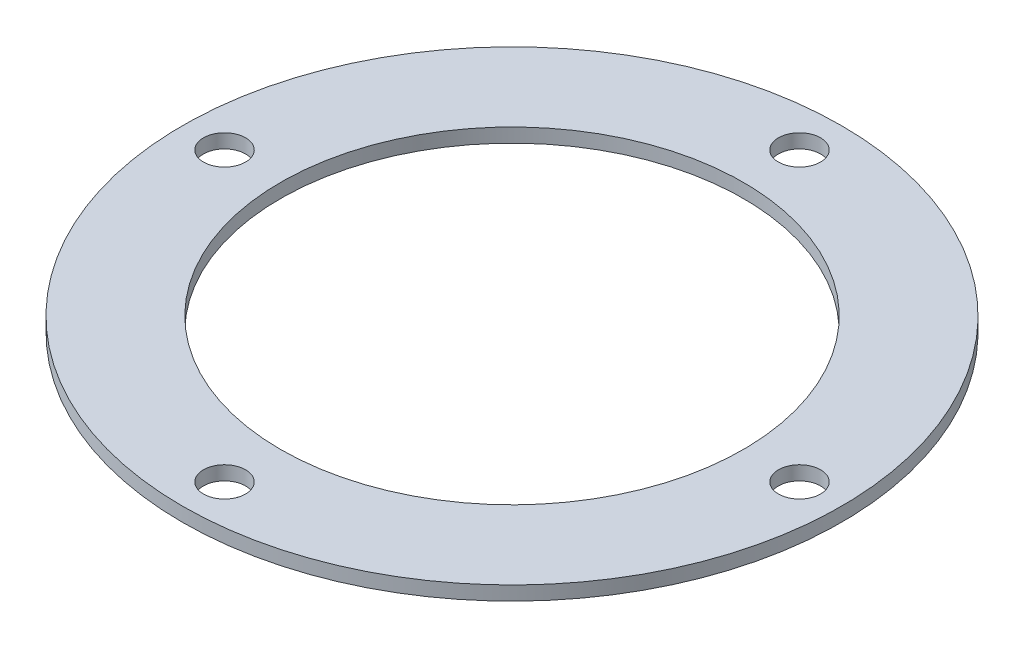
ISO-10303-21;
HEADER;
FILE_DESCRIPTION(('STEP AP214'),'2;1');
FILE_NAME('part.step','',(''),(''),'','','');
FILE_SCHEMA(('AUTOMOTIVE_DESIGN { 1 0 10303 214 1 1 1 1 }'));
ENDSEC;
DATA;
#1=APPLICATION_CONTEXT('core data for automotive mechanical design processes');
#2=APPLICATION_PROTOCOL_DEFINITION('international standard','automotive_design',2000,#1);
#3=PRODUCT_CONTEXT('',#1,'mechanical');
#4=PRODUCT('Part','Part','',(#3));
#5=PRODUCT_RELATED_PRODUCT_CATEGORY('part','',(#4));
#6=PRODUCT_DEFINITION_FORMATION('','',#4);
#7=PRODUCT_DEFINITION_CONTEXT('part definition',#1,'design');
#8=PRODUCT_DEFINITION('design','',#6,#7);
#9=PRODUCT_DEFINITION_SHAPE('','',#8);
#10=(LENGTH_UNIT() NAMED_UNIT(*) SI_UNIT(.MILLI.,.METRE.));
#11=(NAMED_UNIT(*) PLANE_ANGLE_UNIT() SI_UNIT($,.RADIAN.));
#12=(NAMED_UNIT(*) SI_UNIT($,.STERADIAN.) SOLID_ANGLE_UNIT());
#13=UNCERTAINTY_MEASURE_WITH_UNIT(LENGTH_MEASURE(1.E-05),#10,'distance_accuracy_value','');
#14=(GEOMETRIC_REPRESENTATION_CONTEXT(3) GLOBAL_UNCERTAINTY_ASSIGNED_CONTEXT((#13)) GLOBAL_UNIT_ASSIGNED_CONTEXT((#10,
#11,#12)) REPRESENTATION_CONTEXT('',''));
#15=CARTESIAN_POINT('',(0.,0.,0.));
#16=DIRECTION('',(0.,0.,1.));
#17=DIRECTION('',(1.,0.,0.));
#18=AXIS2_PLACEMENT_3D('',#15,#16,#17);
#19=CARTESIAN_POINT('',(0.,1.,0.));
#20=DIRECTION('',(0.,1.,0.));
#21=DIRECTION('',(0.,0.,1.));
#22=AXIS2_PLACEMENT_3D('',#19,#20,#21);
#23=PLANE('',#22);
#24=CARTESIAN_POINT('',(20.5,1.,0.));
#25=DIRECTION('',(0.,1.,0.));
#26=DIRECTION('',(0.,0.,1.));
#27=AXIS2_PLACEMENT_3D('',#24,#25,#26);
#28=CIRCLE('',#27,1.5);
#29=CARTESIAN_POINT('',(20.5,1.,1.5));
#30=VERTEX_POINT('',#29);
#31=EDGE_CURVE('E76',#30,#30,#28,.T.);
#32=ORIENTED_EDGE('',*,*,#31,.F.);
#33=EDGE_LOOP('',(#32));
#34=FACE_BOUND('',#33,.T.);
#35=CARTESIAN_POINT('',(-3.55618312575245E-13,1.,20.5));
#36=DIRECTION('',(0.,1.,0.));
#37=DIRECTION('',(0.,0.,1.));
#38=AXIS2_PLACEMENT_3D('',#35,#36,#37);
#39=CIRCLE('',#38,1.5);
#40=CARTESIAN_POINT('',(-3.55618312575245E-13,1.,22.));
#41=VERTEX_POINT('',#40);
#42=EDGE_CURVE('E71',#41,#41,#39,.T.);
#43=ORIENTED_EDGE('',*,*,#42,.F.);
#44=EDGE_LOOP('',(#43));
#45=FACE_BOUND('',#44,.T.);
#46=CARTESIAN_POINT('',(-20.5,1.,-4.25007251614318E-13));
#47=DIRECTION('',(0.,1.,0.));
#48=DIRECTION('',(0.,0.,1.));
#49=AXIS2_PLACEMENT_3D('',#46,#47,#48);
#50=CIRCLE('',#49,1.5);
#51=CARTESIAN_POINT('',(-20.5,1.,1.49999999999958));
#52=VERTEX_POINT('',#51);
#53=EDGE_CURVE('E70',#52,#52,#50,.T.);
#54=ORIENTED_EDGE('',*,*,#53,.F.);
#55=EDGE_LOOP('',(#54));
#56=FACE_BOUND('',#55,.T.);
#57=CARTESIAN_POINT('',(2.18808879264275E-13,1.,-20.5));
#58=DIRECTION('',(0.,1.,0.));
#59=DIRECTION('',(0.,0.,1.));
#60=AXIS2_PLACEMENT_3D('',#57,#58,#59);
#61=CIRCLE('',#60,1.5);
#62=CARTESIAN_POINT('',(2.18808879264275E-13,1.,-19.));
#63=VERTEX_POINT('',#62);
#64=EDGE_CURVE('E61',#63,#63,#61,.T.);
#65=ORIENTED_EDGE('',*,*,#64,.F.);
#66=EDGE_LOOP('',(#65));
#67=FACE_BOUND('',#66,.T.);
#68=CARTESIAN_POINT('',(0.,1.,0.));
#69=DIRECTION('',(0.,1.,0.));
#70=DIRECTION('',(0.,0.,1.));
#71=AXIS2_PLACEMENT_3D('',#68,#69,#70);
#72=CIRCLE('',#71,23.5);
#73=CARTESIAN_POINT('',(0.,1.,23.5));
#74=VERTEX_POINT('',#73);
#75=EDGE_CURVE('E10',#74,#74,#72,.T.);
#76=ORIENTED_EDGE('',*,*,#75,.T.);
#77=EDGE_LOOP('',(#76));
#78=FACE_BOUND('',#77,.T.);
#79=CARTESIAN_POINT('',(0.,1.,0.));
#80=DIRECTION('',(0.,1.,0.));
#81=DIRECTION('',(0.,0.,1.));
#82=AXIS2_PLACEMENT_3D('',#79,#80,#81);
#83=CIRCLE('',#82,16.5);
#84=CARTESIAN_POINT('',(0.,1.,16.5));
#85=VERTEX_POINT('',#84);
#86=EDGE_CURVE('E49',#85,#85,#83,.T.);
#87=ORIENTED_EDGE('',*,*,#86,.F.);
#88=EDGE_LOOP('',(#87));
#89=FACE_BOUND('',#88,.T.);
#90=ADVANCED_FACE('F39',(#34,#45,#56,#67,#78,#89),#23,.T.);
#91=CARTESIAN_POINT('',(0.,0.,0.));
#92=DIRECTION('',(0.,1.,0.));
#93=DIRECTION('',(0.,0.,1.));
#94=AXIS2_PLACEMENT_3D('',#91,#92,#93);
#95=PLANE('',#94);
#96=CARTESIAN_POINT('',(20.5,0.,0.));
#97=DIRECTION('',(0.,1.,0.));
#98=DIRECTION('',(0.,0.,1.));
#99=AXIS2_PLACEMENT_3D('',#96,#97,#98);
#100=CIRCLE('',#99,1.5);
#101=CARTESIAN_POINT('',(20.5,0.,1.5));
#102=VERTEX_POINT('',#101);
#103=EDGE_CURVE('E54',#102,#102,#100,.T.);
#104=ORIENTED_EDGE('',*,*,#103,.T.);
#105=EDGE_LOOP('',(#104));
#106=FACE_BOUND('',#105,.T.);
#107=CARTESIAN_POINT('',(-3.55618312575245E-13,0.,20.5));
#108=DIRECTION('',(0.,1.,0.));
#109=DIRECTION('',(0.,0.,1.));
#110=AXIS2_PLACEMENT_3D('',#107,#108,#109);
#111=CIRCLE('',#110,1.5);
#112=CARTESIAN_POINT('',(-3.55618312575245E-13,0.,22.));
#113=VERTEX_POINT('',#112);
#114=EDGE_CURVE('E69',#113,#113,#111,.T.);
#115=ORIENTED_EDGE('',*,*,#114,.T.);
#116=EDGE_LOOP('',(#115));
#117=FACE_BOUND('',#116,.T.);
#118=CARTESIAN_POINT('',(-20.5,0.,-4.25007251614318E-13));
#119=DIRECTION('',(0.,1.,0.));
#120=DIRECTION('',(0.,0.,1.));
#121=AXIS2_PLACEMENT_3D('',#118,#119,#120);
#122=CIRCLE('',#121,1.5);
#123=CARTESIAN_POINT('',(-20.5,0.,1.49999999999958));
#124=VERTEX_POINT('',#123);
#125=EDGE_CURVE('E63',#124,#124,#122,.T.);
#126=ORIENTED_EDGE('',*,*,#125,.T.);
#127=EDGE_LOOP('',(#126));
#128=FACE_BOUND('',#127,.T.);
#129=CARTESIAN_POINT('',(2.18808879264275E-13,0.,-20.5));
#130=DIRECTION('',(0.,1.,0.));
#131=DIRECTION('',(0.,0.,1.));
#132=AXIS2_PLACEMENT_3D('',#129,#130,#131);
#133=CIRCLE('',#132,1.5);
#134=CARTESIAN_POINT('',(2.18808879264275E-13,0.,-19.));
#135=VERTEX_POINT('',#134);
#136=EDGE_CURVE('E59',#135,#135,#133,.T.);
#137=ORIENTED_EDGE('',*,*,#136,.T.);
#138=EDGE_LOOP('',(#137));
#139=FACE_BOUND('',#138,.T.);
#140=CARTESIAN_POINT('',(0.,0.,0.));
#141=DIRECTION('',(0.,1.,0.));
#142=DIRECTION('',(0.,0.,1.));
#143=AXIS2_PLACEMENT_3D('',#140,#141,#142);
#144=CIRCLE('',#143,23.5);
#145=CARTESIAN_POINT('',(0.,0.,23.5));
#146=VERTEX_POINT('',#145);
#147=EDGE_CURVE('E43',#146,#146,#144,.T.);
#148=ORIENTED_EDGE('',*,*,#147,.F.);
#149=EDGE_LOOP('',(#148));
#150=FACE_BOUND('',#149,.T.);
#151=CARTESIAN_POINT('',(0.,0.,0.));
#152=DIRECTION('',(0.,1.,0.));
#153=DIRECTION('',(0.,0.,1.));
#154=AXIS2_PLACEMENT_3D('',#151,#152,#153);
#155=CIRCLE('',#154,16.5);
#156=CARTESIAN_POINT('',(0.,0.,16.5));
#157=VERTEX_POINT('',#156);
#158=EDGE_CURVE('E55',#157,#157,#155,.T.);
#159=ORIENTED_EDGE('',*,*,#158,.T.);
#160=EDGE_LOOP('',(#159));
#161=FACE_BOUND('',#160,.T.);
#162=ADVANCED_FACE('F85',(#106,#117,#128,#139,#150,#161),#95,.F.);
#163=CARTESIAN_POINT('',(0.,1.,0.));
#164=DIRECTION('',(0.,-1.,0.));
#165=DIRECTION('',(0.,0.,-1.));
#166=AXIS2_PLACEMENT_3D('',#163,#164,#165);
#167=CYLINDRICAL_SURFACE('',#166,23.5);
#168=ORIENTED_EDGE('',*,*,#75,.F.);
#169=EDGE_LOOP('',(#168));
#170=FACE_BOUND('',#169,.T.);
#171=ORIENTED_EDGE('',*,*,#147,.T.);
#172=EDGE_LOOP('',(#171));
#173=FACE_BOUND('',#172,.T.);
#174=ADVANCED_FACE('F41',(#170,#173),#167,.T.);
#175=CARTESIAN_POINT('',(0.,1.,0.));
#176=DIRECTION('',(0.,-1.,0.));
#177=DIRECTION('',(0.,0.,-1.));
#178=AXIS2_PLACEMENT_3D('',#175,#176,#177);
#179=CYLINDRICAL_SURFACE('',#178,16.5);
#180=ORIENTED_EDGE('',*,*,#86,.T.);
#181=EDGE_LOOP('',(#180));
#182=FACE_BOUND('',#181,.T.);
#183=ORIENTED_EDGE('',*,*,#158,.F.);
#184=EDGE_LOOP('',(#183));
#185=FACE_BOUND('',#184,.T.);
#186=ADVANCED_FACE('F103',(#182,#185),#179,.F.);
#187=CARTESIAN_POINT('',(2.18808879264275E-13,0.,-20.5));
#188=DIRECTION('',(0.,1.,0.));
#189=DIRECTION('',(0.,0.,1.));
#190=AXIS2_PLACEMENT_3D('',#187,#188,#189);
#191=CYLINDRICAL_SURFACE('',#190,1.5);
#192=ORIENTED_EDGE('',*,*,#136,.F.);
#193=EDGE_LOOP('',(#192));
#194=FACE_BOUND('',#193,.T.);
#195=ORIENTED_EDGE('',*,*,#64,.T.);
#196=EDGE_LOOP('',(#195));
#197=FACE_BOUND('',#196,.T.);
#198=ADVANCED_FACE('F106',(#194,#197),#191,.F.);
#199=CARTESIAN_POINT('',(-20.5,0.,-4.25007251614318E-13));
#200=DIRECTION('',(0.,1.,0.));
#201=DIRECTION('',(0.,0.,1.));
#202=AXIS2_PLACEMENT_3D('',#199,#200,#201);
#203=CYLINDRICAL_SURFACE('',#202,1.5);
#204=ORIENTED_EDGE('',*,*,#125,.F.);
#205=EDGE_LOOP('',(#204));
#206=FACE_BOUND('',#205,.T.);
#207=ORIENTED_EDGE('',*,*,#53,.T.);
#208=EDGE_LOOP('',(#207));
#209=FACE_BOUND('',#208,.T.);
#210=ADVANCED_FACE('F119',(#206,#209),#203,.F.);
#211=CARTESIAN_POINT('',(-3.55618312575245E-13,0.,20.5));
#212=DIRECTION('',(0.,1.,0.));
#213=DIRECTION('',(0.,0.,1.));
#214=AXIS2_PLACEMENT_3D('',#211,#212,#213);
#215=CYLINDRICAL_SURFACE('',#214,1.5);
#216=ORIENTED_EDGE('',*,*,#114,.F.);
#217=EDGE_LOOP('',(#216));
#218=FACE_BOUND('',#217,.T.);
#219=ORIENTED_EDGE('',*,*,#42,.T.);
#220=EDGE_LOOP('',(#219));
#221=FACE_BOUND('',#220,.T.);
#222=ADVANCED_FACE('F86',(#218,#221),#215,.F.);
#223=CARTESIAN_POINT('',(20.5,0.,0.));
#224=DIRECTION('',(0.,1.,0.));
#225=DIRECTION('',(0.,0.,1.));
#226=AXIS2_PLACEMENT_3D('',#223,#224,#225);
#227=CYLINDRICAL_SURFACE('',#226,1.5);
#228=ORIENTED_EDGE('',*,*,#103,.F.);
#229=EDGE_LOOP('',(#228));
#230=FACE_BOUND('',#229,.T.);
#231=ORIENTED_EDGE('',*,*,#31,.T.);
#232=EDGE_LOOP('',(#231));
#233=FACE_BOUND('',#232,.T.);
#234=ADVANCED_FACE('F84',(#230,#233),#227,.F.);
#235=CLOSED_SHELL('',(#90,#162,#174,#186,#198,#210,#222,#234));
#236=MANIFOLD_SOLID_BREP('B2',#235);
#237=ADVANCED_BREP_SHAPE_REPRESENTATION('',(#18,#236),#14);
#238=SHAPE_DEFINITION_REPRESENTATION(#9,#237);
ENDSEC;
END-ISO-10303-21;
